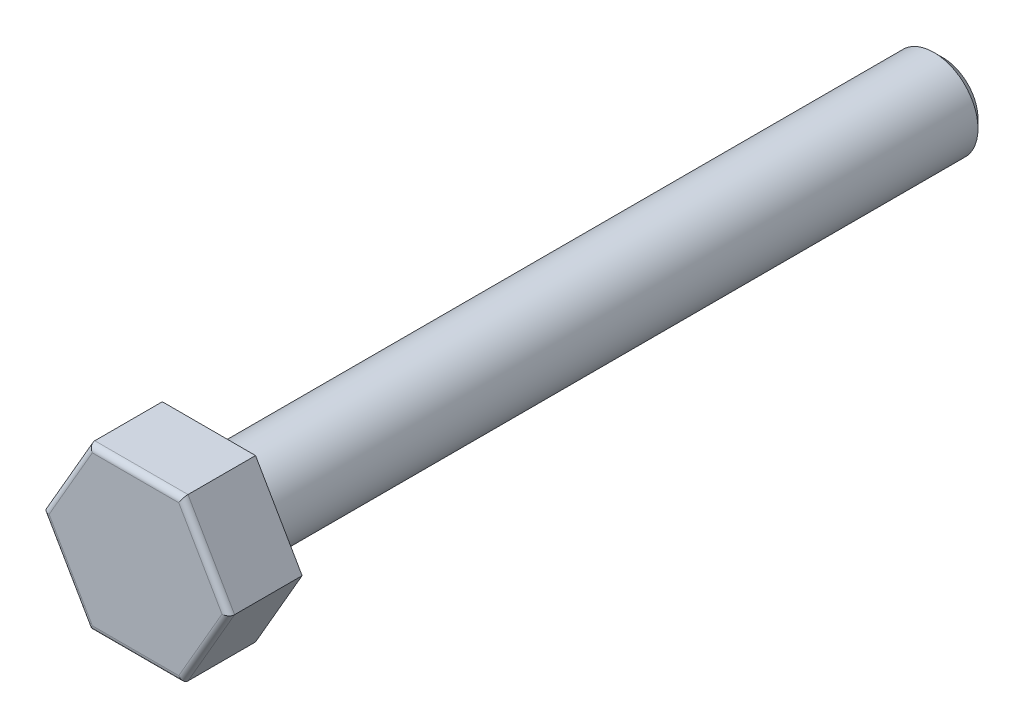
ISO-10303-21;
HEADER;
FILE_DESCRIPTION(('STEP AP214'),'2;1');
FILE_NAME('part.step','',(''),(''),'','','');
FILE_SCHEMA(('AUTOMOTIVE_DESIGN { 1 0 10303 214 1 1 1 1 }'));
ENDSEC;
DATA;
#1=APPLICATION_CONTEXT('core data for automotive mechanical design processes');
#2=APPLICATION_PROTOCOL_DEFINITION('international standard','automotive_design',2000,#1);
#3=PRODUCT_CONTEXT('',#1,'mechanical');
#4=PRODUCT('Part','Part','',(#3));
#5=PRODUCT_RELATED_PRODUCT_CATEGORY('part','',(#4));
#6=PRODUCT_DEFINITION_FORMATION('','',#4);
#7=PRODUCT_DEFINITION_CONTEXT('part definition',#1,'design');
#8=PRODUCT_DEFINITION('design','',#6,#7);
#9=PRODUCT_DEFINITION_SHAPE('','',#8);
#10=(LENGTH_UNIT() NAMED_UNIT(*) SI_UNIT(.MILLI.,.METRE.));
#11=(NAMED_UNIT(*) PLANE_ANGLE_UNIT() SI_UNIT($,.RADIAN.));
#12=(NAMED_UNIT(*) SI_UNIT($,.STERADIAN.) SOLID_ANGLE_UNIT());
#13=UNCERTAINTY_MEASURE_WITH_UNIT(LENGTH_MEASURE(1.E-05),#10,'distance_accuracy_value','');
#14=(GEOMETRIC_REPRESENTATION_CONTEXT(3) GLOBAL_UNCERTAINTY_ASSIGNED_CONTEXT((#13)) GLOBAL_UNIT_ASSIGNED_CONTEXT((#10,
#11,#12)) REPRESENTATION_CONTEXT('',''));
#15=CARTESIAN_POINT('',(0.,0.,0.));
#16=DIRECTION('',(0.,0.,1.));
#17=DIRECTION('',(1.,0.,0.));
#18=AXIS2_PLACEMENT_3D('',#15,#16,#17);
#19=CARTESIAN_POINT('',(0.,0.,0.));
#20=DIRECTION('',(0.,0.,1.));
#21=DIRECTION('',(1.,0.,0.));
#22=AXIS2_PLACEMENT_3D('',#19,#20,#21);
#23=PLANE('',#22);
#24=DIRECTION('',(0.5,0.866025403784439,0.));
#25=VECTOR('',#24,1.);
#26=CARTESIAN_POINT('',(1.58771324027147,-2.75,0.));
#27=LINE('',#26,#25);
#28=CARTESIAN_POINT('',(1.58771324027147,-2.75,0.));
#29=VERTEX_POINT('',#28);
#30=CARTESIAN_POINT('',(3.17542648054294,0.,0.));
#31=VERTEX_POINT('',#30);
#32=EDGE_CURVE('E121',#29,#31,#27,.T.);
#33=ORIENTED_EDGE('',*,*,#32,.F.);
#34=DIRECTION('',(1.,0.,0.));
#35=VECTOR('',#34,1.);
#36=CARTESIAN_POINT('',(-1.58771324027147,-2.75,0.));
#37=LINE('',#36,#35);
#38=CARTESIAN_POINT('',(-1.58771324027147,-2.75,0.));
#39=VERTEX_POINT('',#38);
#40=EDGE_CURVE('E141',#39,#29,#37,.T.);
#41=ORIENTED_EDGE('',*,*,#40,.F.);
#42=DIRECTION('',(0.5,-0.866025403784439,0.));
#43=VECTOR('',#42,1.);
#44=CARTESIAN_POINT('',(-3.17542648054294,0.,0.));
#45=LINE('',#44,#43);
#46=CARTESIAN_POINT('',(-3.17542648054294,0.,0.));
#47=VERTEX_POINT('',#46);
#48=EDGE_CURVE('E138',#47,#39,#45,.T.);
#49=ORIENTED_EDGE('',*,*,#48,.F.);
#50=DIRECTION('',(-0.5,-0.866025403784439,0.));
#51=VECTOR('',#50,1.);
#52=CARTESIAN_POINT('',(-1.58771324027147,2.75,0.));
#53=LINE('',#52,#51);
#54=CARTESIAN_POINT('',(-1.58771324027147,2.75,0.));
#55=VERTEX_POINT('',#54);
#56=EDGE_CURVE('E135',#55,#47,#53,.T.);
#57=ORIENTED_EDGE('',*,*,#56,.F.);
#58=DIRECTION('',(-1.,0.,0.));
#59=VECTOR('',#58,1.);
#60=CARTESIAN_POINT('',(1.58771324027147,2.75,0.));
#61=LINE('',#60,#59);
#62=CARTESIAN_POINT('',(1.58771324027147,2.75,0.));
#63=VERTEX_POINT('',#62);
#64=EDGE_CURVE('E124',#63,#55,#61,.T.);
#65=ORIENTED_EDGE('',*,*,#64,.F.);
#66=DIRECTION('',(-0.5,0.866025403784439,0.));
#67=VECTOR('',#66,1.);
#68=CARTESIAN_POINT('',(3.17542648054294,0.,0.));
#69=LINE('',#68,#67);
#70=EDGE_CURVE('E109',#31,#63,#69,.T.);
#71=ORIENTED_EDGE('',*,*,#70,.F.);
#72=EDGE_LOOP('',(#33,#41,#49,#57,#65,#71));
#73=FACE_BOUND('',#72,.T.);
#74=CARTESIAN_POINT('',(0.,0.,0.));
#75=DIRECTION('',(0.,0.,1.));
#76=DIRECTION('',(1.,0.,0.));
#77=AXIS2_PLACEMENT_3D('',#74,#75,#76);
#78=CIRCLE('',#77,1.5);
#79=CARTESIAN_POINT('',(1.5,0.,0.));
#80=VERTEX_POINT('',#79);
#81=EDGE_CURVE('E114',#80,#80,#78,.F.);
#82=ORIENTED_EDGE('',*,*,#81,.F.);
#83=EDGE_LOOP('',(#82));
#84=FACE_BOUND('',#83,.T.);
#85=ADVANCED_FACE('F36',(#73,#84),#23,.F.);
#86=CARTESIAN_POINT('',(1.58771324027147,-2.75,2.5));
#87=DIRECTION('',(-0.866025403784439,0.5,0.));
#88=DIRECTION('',(-0.5,-0.866025403784439,0.));
#89=AXIS2_PLACEMENT_3D('',#86,#87,#88);
#90=PLANE('',#89);
#91=DIRECTION('',(0.,0.,-1.));
#92=VECTOR('',#91,1.);
#93=CARTESIAN_POINT('',(3.17542648054294,0.,2.5));
#94=LINE('',#93,#92);
#95=CARTESIAN_POINT('',(3.17542648054294,0.,2.3));
#96=VERTEX_POINT('',#95);
#97=EDGE_CURVE('E106',#96,#31,#94,.T.);
#98=ORIENTED_EDGE('',*,*,#97,.F.);
#99=DIRECTION('',(0.5,0.866025403784439,0.));
#100=VECTOR('',#99,1.);
#101=CARTESIAN_POINT('',(1.58771324027147,-2.75,2.3));
#102=LINE('',#101,#100);
#103=CARTESIAN_POINT('',(1.58771324027147,-2.75,2.3));
#104=VERTEX_POINT('',#103);
#105=EDGE_CURVE('E11',#96,#104,#102,.F.);
#106=ORIENTED_EDGE('',*,*,#105,.T.);
#107=DIRECTION('',(0.,0.,-1.));
#108=VECTOR('',#107,1.);
#109=CARTESIAN_POINT('',(1.58771324027147,-2.75,2.5));
#110=LINE('',#109,#108);
#111=EDGE_CURVE('E128',#104,#29,#110,.T.);
#112=ORIENTED_EDGE('',*,*,#111,.T.);
#113=ORIENTED_EDGE('',*,*,#32,.T.);
#114=EDGE_LOOP('',(#98,#106,#112,#113));
#115=FACE_BOUND('',#114,.T.);
#116=ADVANCED_FACE('F126',(#115),#90,.F.);
#117=CARTESIAN_POINT('',(3.17542648054294,0.,2.5));
#118=DIRECTION('',(-0.866025403784439,-0.5,0.));
#119=DIRECTION('',(0.5,-0.866025403784439,0.));
#120=AXIS2_PLACEMENT_3D('',#117,#118,#119);
#121=PLANE('',#120);
#122=DIRECTION('',(0.,0.,-1.));
#123=VECTOR('',#122,1.);
#124=CARTESIAN_POINT('',(1.58771324027147,2.75,2.5));
#125=LINE('',#124,#123);
#126=CARTESIAN_POINT('',(1.58771324027147,2.75,2.3));
#127=VERTEX_POINT('',#126);
#128=EDGE_CURVE('E115',#127,#63,#125,.T.);
#129=ORIENTED_EDGE('',*,*,#128,.F.);
#130=DIRECTION('',(-0.5,0.866025403784439,0.));
#131=VECTOR('',#130,1.);
#132=CARTESIAN_POINT('',(3.17542648054294,0.,2.3));
#133=LINE('',#132,#131);
#134=EDGE_CURVE('E45',#127,#96,#133,.F.);
#135=ORIENTED_EDGE('',*,*,#134,.T.);
#136=ORIENTED_EDGE('',*,*,#97,.T.);
#137=ORIENTED_EDGE('',*,*,#70,.T.);
#138=EDGE_LOOP('',(#129,#135,#136,#137));
#139=FACE_BOUND('',#138,.T.);
#140=ADVANCED_FACE('F108',(#139),#121,.F.);
#141=CARTESIAN_POINT('',(1.58771324027147,2.75,2.5));
#142=DIRECTION('',(0.,-1.,0.));
#143=DIRECTION('',(0.,0.,-1.));
#144=AXIS2_PLACEMENT_3D('',#141,#142,#143);
#145=PLANE('',#144);
#146=DIRECTION('',(0.,0.,-1.));
#147=VECTOR('',#146,1.);
#148=CARTESIAN_POINT('',(-1.58771324027147,2.75,2.5));
#149=LINE('',#148,#147);
#150=CARTESIAN_POINT('',(-1.58771324027147,2.75,2.3));
#151=VERTEX_POINT('',#150);
#152=EDGE_CURVE('E148',#151,#55,#149,.T.);
#153=ORIENTED_EDGE('',*,*,#152,.F.);
#154=DIRECTION('',(-1.,0.,0.));
#155=VECTOR('',#154,1.);
#156=CARTESIAN_POINT('',(1.58771324027147,2.75,2.3));
#157=LINE('',#156,#155);
#158=EDGE_CURVE('E60',#151,#127,#157,.F.);
#159=ORIENTED_EDGE('',*,*,#158,.T.);
#160=ORIENTED_EDGE('',*,*,#128,.T.);
#161=ORIENTED_EDGE('',*,*,#64,.T.);
#162=EDGE_LOOP('',(#153,#159,#160,#161));
#163=FACE_BOUND('',#162,.T.);
#164=ADVANCED_FACE('F250',(#163),#145,.F.);
#165=CARTESIAN_POINT('',(-1.58771324027147,2.75,2.5));
#166=DIRECTION('',(0.866025403784439,-0.5,0.));
#167=DIRECTION('',(0.5,0.866025403784439,0.));
#168=AXIS2_PLACEMENT_3D('',#165,#166,#167);
#169=PLANE('',#168);
#170=DIRECTION('',(0.,0.,-1.));
#171=VECTOR('',#170,1.);
#172=CARTESIAN_POINT('',(-3.17542648054294,0.,2.5));
#173=LINE('',#172,#171);
#174=CARTESIAN_POINT('',(-3.17542648054294,0.,2.3));
#175=VERTEX_POINT('',#174);
#176=EDGE_CURVE('E146',#175,#47,#173,.T.);
#177=ORIENTED_EDGE('',*,*,#176,.F.);
#178=DIRECTION('',(-0.5,-0.866025403784439,0.));
#179=VECTOR('',#178,1.);
#180=CARTESIAN_POINT('',(-1.58771324027147,2.75,2.3));
#181=LINE('',#180,#179);
#182=EDGE_CURVE('E177',#175,#151,#181,.F.);
#183=ORIENTED_EDGE('',*,*,#182,.T.);
#184=ORIENTED_EDGE('',*,*,#152,.T.);
#185=ORIENTED_EDGE('',*,*,#56,.T.);
#186=EDGE_LOOP('',(#177,#183,#184,#185));
#187=FACE_BOUND('',#186,.T.);
#188=ADVANCED_FACE('F224',(#187),#169,.F.);
#189=CARTESIAN_POINT('',(-3.17542648054294,0.,2.5));
#190=DIRECTION('',(0.866025403784439,0.5,0.));
#191=DIRECTION('',(-0.5,0.866025403784439,0.));
#192=AXIS2_PLACEMENT_3D('',#189,#190,#191);
#193=PLANE('',#192);
#194=DIRECTION('',(0.,0.,-1.));
#195=VECTOR('',#194,1.);
#196=CARTESIAN_POINT('',(-1.58771324027147,-2.75,2.5));
#197=LINE('',#196,#195);
#198=CARTESIAN_POINT('',(-1.58771324027147,-2.75,2.3));
#199=VERTEX_POINT('',#198);
#200=EDGE_CURVE('E144',#199,#39,#197,.T.);
#201=ORIENTED_EDGE('',*,*,#200,.F.);
#202=DIRECTION('',(0.5,-0.866025403784439,0.));
#203=VECTOR('',#202,1.);
#204=CARTESIAN_POINT('',(-3.17542648054294,0.,2.3));
#205=LINE('',#204,#203);
#206=EDGE_CURVE('E175',#199,#175,#205,.F.);
#207=ORIENTED_EDGE('',*,*,#206,.T.);
#208=ORIENTED_EDGE('',*,*,#176,.T.);
#209=ORIENTED_EDGE('',*,*,#48,.T.);
#210=EDGE_LOOP('',(#201,#207,#208,#209));
#211=FACE_BOUND('',#210,.T.);
#212=ADVANCED_FACE('F221',(#211),#193,.F.);
#213=CARTESIAN_POINT('',(-1.58771324027147,-2.75,2.5));
#214=DIRECTION('',(0.,1.,0.));
#215=DIRECTION('',(0.,0.,1.));
#216=AXIS2_PLACEMENT_3D('',#213,#214,#215);
#217=PLANE('',#216);
#218=ORIENTED_EDGE('',*,*,#111,.F.);
#219=DIRECTION('',(1.,0.,0.));
#220=VECTOR('',#219,1.);
#221=CARTESIAN_POINT('',(-1.58771324027147,-2.75,2.3));
#222=LINE('',#221,#220);
#223=EDGE_CURVE('E172',#104,#199,#222,.F.);
#224=ORIENTED_EDGE('',*,*,#223,.T.);
#225=ORIENTED_EDGE('',*,*,#200,.T.);
#226=ORIENTED_EDGE('',*,*,#40,.T.);
#227=EDGE_LOOP('',(#218,#224,#225,#226));
#228=FACE_BOUND('',#227,.T.);
#229=ADVANCED_FACE('F210',(#228),#217,.F.);
#230=CARTESIAN_POINT('',(0.,0.,2.5));
#231=DIRECTION('',(0.,0.,1.));
#232=DIRECTION('',(1.,0.,0.));
#233=AXIS2_PLACEMENT_3D('',#230,#231,#232);
#234=PLANE('',#233);
#235=DIRECTION('',(0.5,-0.866025403784439,0.));
#236=VECTOR('',#235,1.);
#237=CARTESIAN_POINT('',(-1.41450815951458,-2.65,2.5));
#238=LINE('',#237,#236);
#239=CARTESIAN_POINT('',(-2.94448637286709,0.,2.5));
#240=VERTEX_POINT('',#239);
#241=CARTESIAN_POINT('',(-1.47224318643354,-2.55,2.5));
#242=VERTEX_POINT('',#241);
#243=EDGE_CURVE('E167',#240,#242,#238,.T.);
#244=ORIENTED_EDGE('',*,*,#243,.T.);
#245=DIRECTION('',(1.,0.,0.));
#246=VECTOR('',#245,1.);
#247=CARTESIAN_POINT('',(1.58771324027147,-2.55,2.5));
#248=LINE('',#247,#246);
#249=CARTESIAN_POINT('',(1.47224318643355,-2.55,2.5));
#250=VERTEX_POINT('',#249);
#251=EDGE_CURVE('E169',#242,#250,#248,.T.);
#252=ORIENTED_EDGE('',*,*,#251,.T.);
#253=DIRECTION('',(0.5,0.866025403784439,0.));
#254=VECTOR('',#253,1.);
#255=CARTESIAN_POINT('',(3.00222139978605,0.1,2.5));
#256=LINE('',#255,#254);
#257=CARTESIAN_POINT('',(2.94448637286709,0.,2.5));
#258=VERTEX_POINT('',#257);
#259=EDGE_CURVE('E159',#250,#258,#256,.T.);
#260=ORIENTED_EDGE('',*,*,#259,.T.);
#261=DIRECTION('',(-0.5,0.866025403784439,0.));
#262=VECTOR('',#261,1.);
#263=CARTESIAN_POINT('',(1.41450815951458,2.65,2.5));
#264=LINE('',#263,#262);
#265=CARTESIAN_POINT('',(1.47224318643355,2.55,2.5));
#266=VERTEX_POINT('',#265);
#267=EDGE_CURVE('E161',#258,#266,#264,.T.);
#268=ORIENTED_EDGE('',*,*,#267,.T.);
#269=DIRECTION('',(-1.,0.,0.));
#270=VECTOR('',#269,1.);
#271=CARTESIAN_POINT('',(-1.58771324027147,2.55,2.5));
#272=LINE('',#271,#270);
#273=CARTESIAN_POINT('',(-1.47224318643355,2.55,2.5));
#274=VERTEX_POINT('',#273);
#275=EDGE_CURVE('E163',#266,#274,#272,.T.);
#276=ORIENTED_EDGE('',*,*,#275,.T.);
#277=DIRECTION('',(-0.5,-0.866025403784439,0.));
#278=VECTOR('',#277,1.);
#279=CARTESIAN_POINT('',(-3.00222139978605,-0.100000000000001,2.5));
#280=LINE('',#279,#278);
#281=EDGE_CURVE('E165',#274,#240,#280,.T.);
#282=ORIENTED_EDGE('',*,*,#281,.T.);
#283=EDGE_LOOP('',(#244,#252,#260,#268,#276,#282));
#284=FACE_BOUND('',#283,.T.);
#285=ADVANCED_FACE('F200',(#284),#234,.T.);
#286=CARTESIAN_POINT('',(0.,0.,-25.));
#287=DIRECTION('',(0.,0.,1.));
#288=DIRECTION('',(1.,0.,0.));
#289=AXIS2_PLACEMENT_3D('',#286,#287,#288);
#290=CYLINDRICAL_SURFACE('',#289,1.5);
#291=CARTESIAN_POINT('',(0.,0.,-24.7));
#292=DIRECTION('',(0.,0.,-1.));
#293=DIRECTION('',(-1.,0.,0.));
#294=AXIS2_PLACEMENT_3D('',#291,#292,#293);
#295=CIRCLE('',#294,1.5);
#296=CARTESIAN_POINT('',(-1.5,0.,-24.7));
#297=VERTEX_POINT('',#296);
#298=EDGE_CURVE('E156',#297,#297,#295,.F.);
#299=ORIENTED_EDGE('',*,*,#298,.T.);
#300=EDGE_LOOP('',(#299));
#301=FACE_BOUND('',#300,.T.);
#302=ORIENTED_EDGE('',*,*,#81,.T.);
#303=EDGE_LOOP('',(#302));
#304=FACE_BOUND('',#303,.T.);
#305=ADVANCED_FACE('F310',(#301,#304),#290,.T.);
#306=CARTESIAN_POINT('',(0.,0.,-25.));
#307=DIRECTION('',(0.,0.,-1.));
#308=DIRECTION('',(-1.,0.,0.));
#309=AXIS2_PLACEMENT_3D('',#306,#307,#308);
#310=PLANE('',#309);
#311=CARTESIAN_POINT('',(0.,0.,-25.));
#312=DIRECTION('',(0.,0.,-1.));
#313=DIRECTION('',(-1.,0.,0.));
#314=AXIS2_PLACEMENT_3D('',#311,#312,#313);
#315=CIRCLE('',#314,1.2);
#316=CARTESIAN_POINT('',(-1.2,0.,-25.));
#317=VERTEX_POINT('',#316);
#318=EDGE_CURVE('E153',#317,#317,#315,.T.);
#319=ORIENTED_EDGE('',*,*,#318,.T.);
#320=EDGE_LOOP('',(#319));
#321=FACE_BOUND('',#320,.T.);
#322=ADVANCED_FACE('F257',(#321),#310,.T.);
#323=CARTESIAN_POINT('',(0.,0.,-25.));
#324=DIRECTION('',(0.,0.,1.));
#325=DIRECTION('',(1.,0.,0.));
#326=AXIS2_PLACEMENT_3D('',#323,#324,#325);
#327=CONICAL_SURFACE('',#326,1.2,0.785398163397452);
#328=ORIENTED_EDGE('',*,*,#298,.F.);
#329=EDGE_LOOP('',(#328));
#330=FACE_BOUND('',#329,.T.);
#331=ORIENTED_EDGE('',*,*,#318,.F.);
#332=EDGE_LOOP('',(#331));
#333=FACE_BOUND('',#332,.T.);
#334=ADVANCED_FACE('F234',(#330,#333),#327,.T.);
#335=CARTESIAN_POINT('',(0.,2.55,2.3));
#336=DIRECTION('',(1.,0.,0.));
#337=DIRECTION('',(0.,0.,-1.));
#338=AXIS2_PLACEMENT_3D('',#335,#336,#337);
#339=CYLINDRICAL_SURFACE('',#338,0.2);
#340=CARTESIAN_POINT('',(1.47224318643355,2.55,2.3));
#341=DIRECTION('',(0.866025403784439,-0.5,0.));
#342=DIRECTION('',(-0.5,-0.866025403784439,0.));
#343=AXIS2_PLACEMENT_3D('',#340,#341,#342);
#344=ELLIPSE('',#343,0.23094010767585,0.2);
#345=EDGE_CURVE('E132',#127,#266,#344,.T.);
#346=ORIENTED_EDGE('',*,*,#345,.F.);
#347=ORIENTED_EDGE('',*,*,#158,.F.);
#348=CARTESIAN_POINT('',(-1.47224318643355,2.55,2.3));
#349=DIRECTION('',(0.866025403784439,0.5,0.));
#350=DIRECTION('',(0.5,-0.866025403784439,0.));
#351=AXIS2_PLACEMENT_3D('',#348,#349,#350);
#352=ELLIPSE('',#351,0.23094010767585,0.2);
#353=EDGE_CURVE('E40',#274,#151,#352,.F.);
#354=ORIENTED_EDGE('',*,*,#353,.F.);
#355=ORIENTED_EDGE('',*,*,#275,.F.);
#356=EDGE_LOOP('',(#346,#347,#354,#355));
#357=FACE_BOUND('',#356,.T.);
#358=ADVANCED_FACE('F38',(#357),#339,.T.);
#359=CARTESIAN_POINT('',(-2.20836477965032,1.275,2.3));
#360=DIRECTION('',(0.5,0.866025403784439,0.));
#361=DIRECTION('',(-0.866025403784439,0.5,0.));
#362=AXIS2_PLACEMENT_3D('',#359,#360,#361);
#363=CYLINDRICAL_SURFACE('',#362,0.2);
#364=ORIENTED_EDGE('',*,*,#353,.T.);
#365=ORIENTED_EDGE('',*,*,#182,.F.);
#366=CARTESIAN_POINT('',(-2.94448637286709,0.,2.3));
#367=DIRECTION('',(0.,1.,0.));
#368=DIRECTION('',(1.,0.,0.));
#369=AXIS2_PLACEMENT_3D('',#366,#367,#368);
#370=ELLIPSE('',#369,0.23094010767585,0.2);
#371=EDGE_CURVE('E188',#240,#175,#370,.F.);
#372=ORIENTED_EDGE('',*,*,#371,.F.);
#373=ORIENTED_EDGE('',*,*,#281,.F.);
#374=EDGE_LOOP('',(#364,#365,#372,#373));
#375=FACE_BOUND('',#374,.T.);
#376=ADVANCED_FACE('F227',(#375),#363,.T.);
#377=CARTESIAN_POINT('',(2.20836477965032,1.275,2.3));
#378=DIRECTION('',(0.5,-0.866025403784439,0.));
#379=DIRECTION('',(0.866025403784439,0.5,0.));
#380=AXIS2_PLACEMENT_3D('',#377,#378,#379);
#381=CYLINDRICAL_SURFACE('',#380,0.2);
#382=ORIENTED_EDGE('',*,*,#345,.T.);
#383=ORIENTED_EDGE('',*,*,#267,.F.);
#384=CARTESIAN_POINT('',(2.94448637286709,0.,2.3));
#385=DIRECTION('',(0.,-1.,0.));
#386=DIRECTION('',(-1.,0.,0.));
#387=AXIS2_PLACEMENT_3D('',#384,#385,#386);
#388=ELLIPSE('',#387,0.23094010767585,0.2);
#389=EDGE_CURVE('E185',#96,#258,#388,.T.);
#390=ORIENTED_EDGE('',*,*,#389,.F.);
#391=ORIENTED_EDGE('',*,*,#134,.F.);
#392=EDGE_LOOP('',(#382,#383,#390,#391));
#393=FACE_BOUND('',#392,.T.);
#394=ADVANCED_FACE('F194',(#393),#381,.T.);
#395=CARTESIAN_POINT('',(-2.20836477965032,-1.275,2.3));
#396=DIRECTION('',(-0.5,0.866025403784439,0.));
#397=DIRECTION('',(-0.866025403784439,-0.5,0.));
#398=AXIS2_PLACEMENT_3D('',#395,#396,#397);
#399=CYLINDRICAL_SURFACE('',#398,0.2);
#400=ORIENTED_EDGE('',*,*,#371,.T.);
#401=ORIENTED_EDGE('',*,*,#206,.F.);
#402=CARTESIAN_POINT('',(-1.47224318643354,-2.55,2.3));
#403=DIRECTION('',(-0.866025403784439,0.5,0.));
#404=DIRECTION('',(0.5,0.866025403784439,0.));
#405=AXIS2_PLACEMENT_3D('',#402,#403,#404);
#406=ELLIPSE('',#405,0.23094010767585,0.2);
#407=EDGE_CURVE('E183',#242,#199,#406,.F.);
#408=ORIENTED_EDGE('',*,*,#407,.F.);
#409=ORIENTED_EDGE('',*,*,#243,.F.);
#410=EDGE_LOOP('',(#400,#401,#408,#409));
#411=FACE_BOUND('',#410,.T.);
#412=ADVANCED_FACE('F218',(#411),#399,.T.);
#413=CARTESIAN_POINT('',(2.20836477965032,-1.275,2.3));
#414=DIRECTION('',(-0.5,-0.866025403784439,0.));
#415=DIRECTION('',(0.866025403784439,-0.5,0.));
#416=AXIS2_PLACEMENT_3D('',#413,#414,#415);
#417=CYLINDRICAL_SURFACE('',#416,0.2);
#418=ORIENTED_EDGE('',*,*,#389,.T.);
#419=ORIENTED_EDGE('',*,*,#259,.F.);
#420=CARTESIAN_POINT('',(1.47224318643355,-2.55,2.3));
#421=DIRECTION('',(-0.866025403784439,-0.5,0.));
#422=DIRECTION('',(0.5,-0.866025403784439,0.));
#423=AXIS2_PLACEMENT_3D('',#420,#421,#422);
#424=ELLIPSE('',#423,0.23094010767585,0.2);
#425=EDGE_CURVE('E181',#104,#250,#424,.T.);
#426=ORIENTED_EDGE('',*,*,#425,.F.);
#427=ORIENTED_EDGE('',*,*,#105,.F.);
#428=EDGE_LOOP('',(#418,#419,#426,#427));
#429=FACE_BOUND('',#428,.T.);
#430=ADVANCED_FACE('F206',(#429),#417,.T.);
#431=CARTESIAN_POINT('',(0.,-2.55,2.3));
#432=DIRECTION('',(-1.,0.,0.));
#433=DIRECTION('',(0.,0.,1.));
#434=AXIS2_PLACEMENT_3D('',#431,#432,#433);
#435=CYLINDRICAL_SURFACE('',#434,0.2);
#436=ORIENTED_EDGE('',*,*,#407,.T.);
#437=ORIENTED_EDGE('',*,*,#223,.F.);
#438=ORIENTED_EDGE('',*,*,#425,.T.);
#439=ORIENTED_EDGE('',*,*,#251,.F.);
#440=EDGE_LOOP('',(#436,#437,#438,#439));
#441=FACE_BOUND('',#440,.T.);
#442=ADVANCED_FACE('F213',(#441),#435,.T.);
#443=CLOSED_SHELL('',(#85,#116,#140,#164,#188,#212,#229,#285,#305,#322,#334,#358,#376,#394,#412,
#430,#442));
#444=MANIFOLD_SOLID_BREP('B2',#443);
#445=ADVANCED_BREP_SHAPE_REPRESENTATION('',(#18,#444),#14);
#446=SHAPE_DEFINITION_REPRESENTATION(#9,#445);
ENDSEC;
END-ISO-10303-21;
